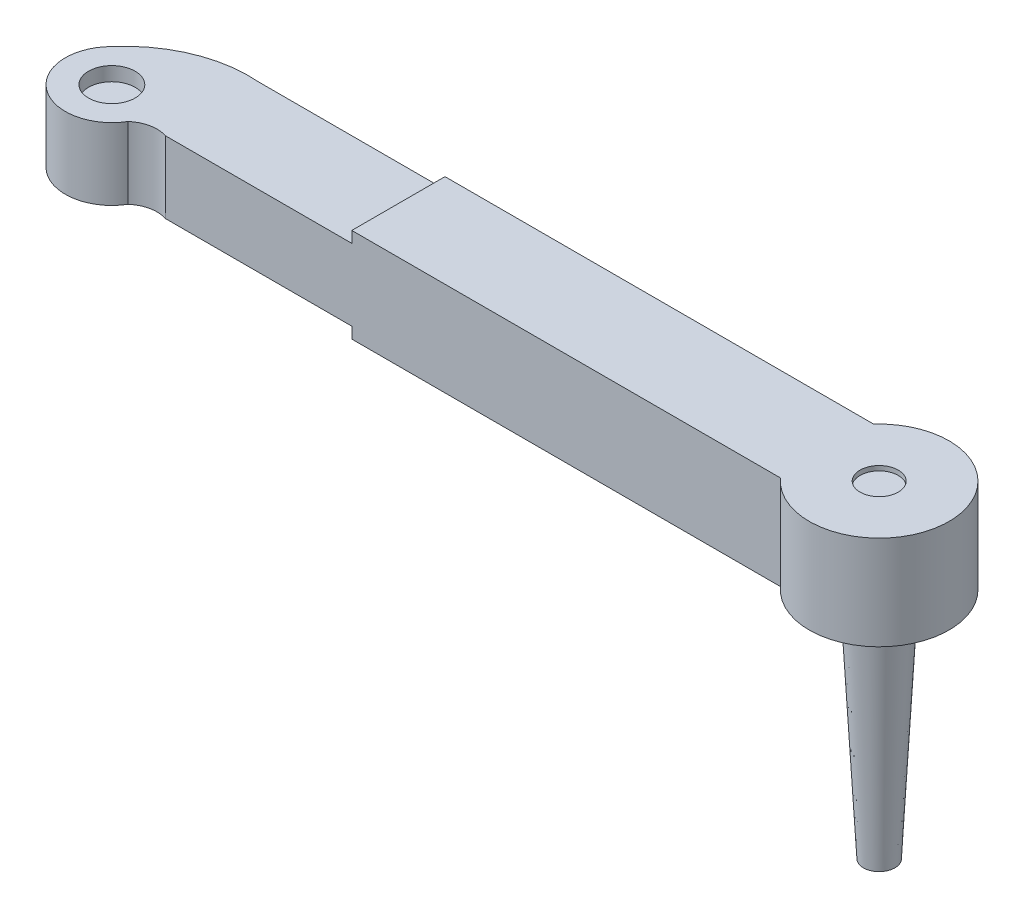
ISO-10303-21;
HEADER;
FILE_DESCRIPTION(('STEP AP214'),'2;1');
FILE_NAME('part.step','',(''),(''),'','','');
FILE_SCHEMA(('AUTOMOTIVE_DESIGN { 1 0 10303 214 1 1 1 1 }'));
ENDSEC;
DATA;
#1=APPLICATION_CONTEXT('core data for automotive mechanical design processes');
#2=APPLICATION_PROTOCOL_DEFINITION('international standard','automotive_design',2000,#1);
#3=PRODUCT_CONTEXT('',#1,'mechanical');
#4=PRODUCT('Part','Part','',(#3));
#5=PRODUCT_RELATED_PRODUCT_CATEGORY('part','',(#4));
#6=PRODUCT_DEFINITION_FORMATION('','',#4);
#7=PRODUCT_DEFINITION_CONTEXT('part definition',#1,'design');
#8=PRODUCT_DEFINITION('design','',#6,#7);
#9=PRODUCT_DEFINITION_SHAPE('','',#8);
#10=(LENGTH_UNIT() NAMED_UNIT(*) SI_UNIT(.MILLI.,.METRE.));
#11=(NAMED_UNIT(*) PLANE_ANGLE_UNIT() SI_UNIT($,.RADIAN.));
#12=(NAMED_UNIT(*) SI_UNIT($,.STERADIAN.) SOLID_ANGLE_UNIT());
#13=UNCERTAINTY_MEASURE_WITH_UNIT(LENGTH_MEASURE(1.E-05),#10,'distance_accuracy_value','');
#14=(GEOMETRIC_REPRESENTATION_CONTEXT(3) GLOBAL_UNCERTAINTY_ASSIGNED_CONTEXT((#13)) GLOBAL_UNIT_ASSIGNED_CONTEXT((#10,
#11,#12)) REPRESENTATION_CONTEXT('',''));
#15=CARTESIAN_POINT('',(0.,0.,0.));
#16=DIRECTION('',(0.,0.,1.));
#17=DIRECTION('',(1.,0.,0.));
#18=AXIS2_PLACEMENT_3D('',#15,#16,#17);
#19=CARTESIAN_POINT('',(-33.,10.1,-5.));
#20=DIRECTION('',(0.,0.,1.));
#21=DIRECTION('',(1.,0.,0.));
#22=AXIS2_PLACEMENT_3D('',#19,#20,#21);
#23=PLANE('',#22);
#24=DIRECTION('',(1.,0.,0.));
#25=VECTOR('',#24,1.);
#26=CARTESIAN_POINT('',(-33.,1.2,-5.));
#27=LINE('',#26,#25);
#28=CARTESIAN_POINT('',(-33.,1.2,-5.));
#29=VERTEX_POINT('',#28);
#30=CARTESIAN_POINT('',(-13.,1.2,-5.));
#31=VERTEX_POINT('',#30);
#32=EDGE_CURVE('E182',#29,#31,#27,.T.);
#33=ORIENTED_EDGE('',*,*,#32,.F.);
#34=DIRECTION('',(0.,-1.,0.));
#35=VECTOR('',#34,1.);
#36=CARTESIAN_POINT('',(-33.,10.1,-5.));
#37=LINE('',#36,#35);
#38=CARTESIAN_POINT('',(-33.,8.9,-5.));
#39=VERTEX_POINT('',#38);
#40=EDGE_CURVE('E148',#39,#29,#37,.T.);
#41=ORIENTED_EDGE('',*,*,#40,.F.);
#42=DIRECTION('',(1.,0.,0.));
#43=VECTOR('',#42,1.);
#44=CARTESIAN_POINT('',(-33.,8.9,-5.));
#45=LINE('',#44,#43);
#46=CARTESIAN_POINT('',(-13.,8.9,-5.));
#47=VERTEX_POINT('',#46);
#48=EDGE_CURVE('E198',#39,#47,#45,.T.);
#49=ORIENTED_EDGE('',*,*,#48,.T.);
#50=DIRECTION('',(0.,1.,0.));
#51=VECTOR('',#50,1.);
#52=CARTESIAN_POINT('',(-13.,10.1,-5.));
#53=LINE('',#52,#51);
#54=CARTESIAN_POINT('',(-13.,10.1,-5.));
#55=VERTEX_POINT('',#54);
#56=EDGE_CURVE('E194',#47,#55,#53,.T.);
#57=ORIENTED_EDGE('',*,*,#56,.T.);
#58=DIRECTION('',(-1.,0.,0.));
#59=VECTOR('',#58,1.);
#60=CARTESIAN_POINT('',(-33.,10.1,-5.));
#61=LINE('',#60,#59);
#62=CARTESIAN_POINT('',(33.,10.1,-5.));
#63=VERTEX_POINT('',#62);
#64=EDGE_CURVE('E215',#63,#55,#61,.T.);
#65=ORIENTED_EDGE('',*,*,#64,.F.);
#66=DIRECTION('',(0.,-1.,0.));
#67=VECTOR('',#66,1.);
#68=CARTESIAN_POINT('',(33.,10.1,-5.));
#69=LINE('',#68,#67);
#70=CARTESIAN_POINT('',(33.,0.,-5.));
#71=VERTEX_POINT('',#70);
#72=EDGE_CURVE('E242',#63,#71,#69,.T.);
#73=ORIENTED_EDGE('',*,*,#72,.T.);
#74=DIRECTION('',(-1.,0.,0.));
#75=VECTOR('',#74,1.);
#76=CARTESIAN_POINT('',(-33.,0.,-5.));
#77=LINE('',#76,#75);
#78=CARTESIAN_POINT('',(-13.,0.,-5.));
#79=VERTEX_POINT('',#78);
#80=EDGE_CURVE('E227',#71,#79,#77,.T.);
#81=ORIENTED_EDGE('',*,*,#80,.T.);
#82=DIRECTION('',(0.,-1.,0.));
#83=VECTOR('',#82,1.);
#84=CARTESIAN_POINT('',(-13.,10.1,-5.));
#85=LINE('',#84,#83);
#86=EDGE_CURVE('E61',#31,#79,#85,.T.);
#87=ORIENTED_EDGE('',*,*,#86,.F.);
#88=EDGE_LOOP('',(#33,#41,#49,#57,#65,#73,#81,#87));
#89=FACE_BOUND('',#88,.T.);
#90=ADVANCED_FACE('F45',(#89),#23,.F.);
#91=CARTESIAN_POINT('',(-33.,10.1,5.));
#92=DIRECTION('',(0.,0.,-1.));
#93=DIRECTION('',(-1.,0.,0.));
#94=AXIS2_PLACEMENT_3D('',#91,#92,#93);
#95=PLANE('',#94);
#96=DIRECTION('',(1.,0.,0.));
#97=VECTOR('',#96,1.);
#98=CARTESIAN_POINT('',(-33.,1.2,5.));
#99=LINE('',#98,#97);
#100=CARTESIAN_POINT('',(-33.,1.2,5.));
#101=VERTEX_POINT('',#100);
#102=CARTESIAN_POINT('',(-13.,1.2,5.));
#103=VERTEX_POINT('',#102);
#104=EDGE_CURVE('E173',#101,#103,#99,.T.);
#105=ORIENTED_EDGE('',*,*,#104,.T.);
#106=DIRECTION('',(0.,-1.,0.));
#107=VECTOR('',#106,1.);
#108=CARTESIAN_POINT('',(-13.,0.,5.));
#109=LINE('',#108,#107);
#110=CARTESIAN_POINT('',(-13.,0.,5.));
#111=VERTEX_POINT('',#110);
#112=EDGE_CURVE('E168',#103,#111,#109,.T.);
#113=ORIENTED_EDGE('',*,*,#112,.T.);
#114=DIRECTION('',(1.,0.,0.));
#115=VECTOR('',#114,1.);
#116=CARTESIAN_POINT('',(-33.,0.,5.));
#117=LINE('',#116,#115);
#118=CARTESIAN_POINT('',(33.,0.,5.));
#119=VERTEX_POINT('',#118);
#120=EDGE_CURVE('E216',#111,#119,#117,.T.);
#121=ORIENTED_EDGE('',*,*,#120,.T.);
#122=DIRECTION('',(0.,-1.,0.));
#123=VECTOR('',#122,1.);
#124=CARTESIAN_POINT('',(33.,10.1,5.));
#125=LINE('',#124,#123);
#126=CARTESIAN_POINT('',(33.,10.1,5.));
#127=VERTEX_POINT('',#126);
#128=EDGE_CURVE('E223',#127,#119,#125,.T.);
#129=ORIENTED_EDGE('',*,*,#128,.F.);
#130=DIRECTION('',(1.,0.,0.));
#131=VECTOR('',#130,1.);
#132=CARTESIAN_POINT('',(-33.,10.1,5.));
#133=LINE('',#132,#131);
#134=CARTESIAN_POINT('',(-13.,10.1,5.));
#135=VERTEX_POINT('',#134);
#136=EDGE_CURVE('E220',#135,#127,#133,.T.);
#137=ORIENTED_EDGE('',*,*,#136,.F.);
#138=DIRECTION('',(0.,1.,0.));
#139=VECTOR('',#138,1.);
#140=CARTESIAN_POINT('',(-13.,10.1,5.));
#141=LINE('',#140,#139);
#142=CARTESIAN_POINT('',(-13.,8.9,5.));
#143=VERTEX_POINT('',#142);
#144=EDGE_CURVE('E68',#143,#135,#141,.T.);
#145=ORIENTED_EDGE('',*,*,#144,.F.);
#146=DIRECTION('',(1.,0.,0.));
#147=VECTOR('',#146,1.);
#148=CARTESIAN_POINT('',(-33.,8.9,5.));
#149=LINE('',#148,#147);
#150=CARTESIAN_POINT('',(-33.,8.9,5.));
#151=VERTEX_POINT('',#150);
#152=EDGE_CURVE('E185',#151,#143,#149,.T.);
#153=ORIENTED_EDGE('',*,*,#152,.F.);
#154=DIRECTION('',(0.,-1.,0.));
#155=VECTOR('',#154,1.);
#156=CARTESIAN_POINT('',(-33.,10.1,5.));
#157=LINE('',#156,#155);
#158=EDGE_CURVE('E236',#151,#101,#157,.T.);
#159=ORIENTED_EDGE('',*,*,#158,.T.);
#160=EDGE_LOOP('',(#105,#113,#121,#129,#137,#145,#153,#159));
#161=FACE_BOUND('',#160,.T.);
#162=ADVANCED_FACE('F251',(#161),#95,.F.);
#163=CARTESIAN_POINT('',(38.5901699437495,0.,0.));
#164=DIRECTION('',(0.,-1.,0.));
#165=DIRECTION('',(0.,0.,-1.));
#166=AXIS2_PLACEMENT_3D('',#163,#164,#165);
#167=PLANE('',#166);
#168=CARTESIAN_POINT('',(38.5901699437495,0.,0.));
#169=DIRECTION('',(0.,-1.,0.));
#170=DIRECTION('',(0.,0.,-1.));
#171=AXIS2_PLACEMENT_3D('',#168,#169,#170);
#172=CIRCLE('',#171,3.);
#173=CARTESIAN_POINT('',(38.5901699437495,0.,-3.));
#174=VERTEX_POINT('',#173);
#175=EDGE_CURVE('E324',#174,#174,#172,.T.);
#176=ORIENTED_EDGE('',*,*,#175,.F.);
#177=EDGE_LOOP('',(#176));
#178=FACE_BOUND('',#177,.T.);
#179=ORIENTED_EDGE('',*,*,#120,.F.);
#180=DIRECTION('',(0.,0.,-1.));
#181=VECTOR('',#180,1.);
#182=CARTESIAN_POINT('',(-13.,0.,0.));
#183=LINE('',#182,#181);
#184=EDGE_CURVE('E11',#111,#79,#183,.T.);
#185=ORIENTED_EDGE('',*,*,#184,.T.);
#186=ORIENTED_EDGE('',*,*,#80,.F.);
#187=CARTESIAN_POINT('',(38.5901699437495,0.,0.));
#188=DIRECTION('',(0.,1.,0.));
#189=DIRECTION('',(0.,0.,-1.));
#190=AXIS2_PLACEMENT_3D('',#187,#188,#189);
#191=CIRCLE('',#190,7.50000000000001);
#192=EDGE_CURVE('E207',#119,#71,#191,.T.);
#193=ORIENTED_EDGE('',*,*,#192,.F.);
#194=EDGE_LOOP('',(#179,#185,#186,#193));
#195=FACE_BOUND('',#194,.T.);
#196=ADVANCED_FACE('F282',(#178,#195),#167,.T.);
#197=CARTESIAN_POINT('',(38.5901699437495,10.1,0.));
#198=DIRECTION('',(0.,-1.,0.));
#199=DIRECTION('',(0.,0.,-1.));
#200=AXIS2_PLACEMENT_3D('',#197,#198,#199);
#201=CYLINDRICAL_SURFACE('',#200,7.50000000000001);
#202=ORIENTED_EDGE('',*,*,#192,.T.);
#203=ORIENTED_EDGE('',*,*,#72,.F.);
#204=CARTESIAN_POINT('',(38.5901699437495,10.1,0.));
#205=DIRECTION('',(0.,1.,0.));
#206=DIRECTION('',(0.,0.,-1.));
#207=AXIS2_PLACEMENT_3D('',#204,#205,#206);
#208=CIRCLE('',#207,7.50000000000001);
#209=EDGE_CURVE('E211',#127,#63,#208,.T.);
#210=ORIENTED_EDGE('',*,*,#209,.F.);
#211=ORIENTED_EDGE('',*,*,#128,.T.);
#212=EDGE_LOOP('',(#202,#203,#210,#211));
#213=FACE_BOUND('',#212,.T.);
#214=ADVANCED_FACE('F47',(#213),#201,.T.);
#215=CARTESIAN_POINT('',(38.5901699437495,10.1,0.));
#216=DIRECTION('',(0.,-1.,0.));
#217=DIRECTION('',(0.,0.,-1.));
#218=AXIS2_PLACEMENT_3D('',#215,#216,#217);
#219=PLANE('',#218);
#220=CARTESIAN_POINT('',(38.5901699437495,10.1,0.));
#221=DIRECTION('',(0.,1.,0.));
#222=DIRECTION('',(0.,0.,1.));
#223=AXIS2_PLACEMENT_3D('',#220,#221,#222);
#224=CIRCLE('',#223,2.04999999999999);
#225=CARTESIAN_POINT('',(38.5901699437495,10.1,2.04999999999999));
#226=VERTEX_POINT('',#225);
#227=EDGE_CURVE('E202',#226,#226,#224,.T.);
#228=ORIENTED_EDGE('',*,*,#227,.F.);
#229=EDGE_LOOP('',(#228));
#230=FACE_BOUND('',#229,.T.);
#231=ORIENTED_EDGE('',*,*,#64,.T.);
#232=DIRECTION('',(0.,0.,1.));
#233=VECTOR('',#232,1.);
#234=CARTESIAN_POINT('',(-13.,10.1,0.));
#235=LINE('',#234,#233);
#236=EDGE_CURVE('E54',#55,#135,#235,.T.);
#237=ORIENTED_EDGE('',*,*,#236,.T.);
#238=ORIENTED_EDGE('',*,*,#136,.T.);
#239=ORIENTED_EDGE('',*,*,#209,.T.);
#240=EDGE_LOOP('',(#231,#237,#238,#239));
#241=FACE_BOUND('',#240,.T.);
#242=ADVANCED_FACE('F248',(#230,#241),#219,.F.);
#243=CARTESIAN_POINT('',(38.5901699437495,9.6,0.));
#244=DIRECTION('',(0.,1.,0.));
#245=DIRECTION('',(0.,0.,1.));
#246=AXIS2_PLACEMENT_3D('',#243,#244,#245);
#247=CYLINDRICAL_SURFACE('',#246,2.04999999999999);
#248=CARTESIAN_POINT('',(38.5901699437495,9.6,0.));
#249=DIRECTION('',(0.,1.,0.));
#250=DIRECTION('',(0.,0.,1.));
#251=AXIS2_PLACEMENT_3D('',#248,#249,#250);
#252=CIRCLE('',#251,2.04999999999999);
#253=CARTESIAN_POINT('',(38.5901699437495,9.6,2.04999999999999));
#254=VERTEX_POINT('',#253);
#255=EDGE_CURVE('E203',#254,#254,#252,.T.);
#256=ORIENTED_EDGE('',*,*,#255,.F.);
#257=EDGE_LOOP('',(#256));
#258=FACE_BOUND('',#257,.T.);
#259=ORIENTED_EDGE('',*,*,#227,.T.);
#260=EDGE_LOOP('',(#259));
#261=FACE_BOUND('',#260,.T.);
#262=ADVANCED_FACE('F290',(#258,#261),#247,.F.);
#263=CARTESIAN_POINT('',(38.5901699437495,9.6,0.));
#264=DIRECTION('',(0.,1.,0.));
#265=DIRECTION('',(0.,0.,1.));
#266=AXIS2_PLACEMENT_3D('',#263,#264,#265);
#267=PLANE('',#266);
#268=ORIENTED_EDGE('',*,*,#255,.T.);
#269=EDGE_LOOP('',(#268));
#270=FACE_BOUND('',#269,.T.);
#271=ADVANCED_FACE('F294',(#270),#267,.T.);
#272=CARTESIAN_POINT('',(-33.,8.9,-7.50000000000001));
#273=DIRECTION('',(0.,-1.,0.));
#274=DIRECTION('',(0.,0.,-1.));
#275=AXIS2_PLACEMENT_3D('',#272,#273,#274);
#276=PLANE('',#275);
#277=CARTESIAN_POINT('',(-40.6248395308679,8.9,3.12162005028124));
#278=DIRECTION('',(0.,1.,0.));
#279=DIRECTION('',(0.,0.,1.));
#280=AXIS2_PLACEMENT_3D('',#277,#278,#279);
#281=CIRCLE('',#280,2.5);
#282=CARTESIAN_POINT('',(-40.6248395308679,8.9,5.62162005028125));
#283=VERTEX_POINT('',#282);
#284=EDGE_CURVE('E156',#283,#283,#281,.T.);
#285=ORIENTED_EDGE('',*,*,#284,.F.);
#286=EDGE_LOOP('',(#285));
#287=FACE_BOUND('',#286,.T.);
#288=ORIENTED_EDGE('',*,*,#48,.F.);
#289=CARTESIAN_POINT('',(-34.0710710988994,8.9,8.25680228038053));
#290=DIRECTION('',(0.,1.,0.));
#291=DIRECTION('',(0.,0.,1.));
#292=AXIS2_PLACEMENT_3D('',#289,#290,#291);
#293=CIRCLE('',#292,13.3);
#294=CARTESIAN_POINT('',(-44.1483908735731,8.9,-0.422922724420649));
#295=VERTEX_POINT('',#294);
#296=EDGE_CURVE('E161',#39,#295,#293,.T.);
#297=ORIENTED_EDGE('',*,*,#296,.T.);
#298=CARTESIAN_POINT('',(-40.6248395308679,8.9,3.12162005028124));
#299=DIRECTION('',(0.,1.,0.));
#300=DIRECTION('',(0.,0.,1.));
#301=AXIS2_PLACEMENT_3D('',#298,#299,#300);
#302=CIRCLE('',#301,4.99791932171485);
#303=CARTESIAN_POINT('',(-36.3301368480292,8.9,5.6779311448838));
#304=VERTEX_POINT('',#303);
#305=EDGE_CURVE('E128',#295,#304,#302,.T.);
#306=ORIENTED_EDGE('',*,*,#305,.T.);
#307=CARTESIAN_POINT('',(-34.0710710988994,8.9,8.25680228038053));
#308=DIRECTION('',(0.,-1.,0.));
#309=DIRECTION('',(0.,0.,1.));
#310=AXIS2_PLACEMENT_3D('',#307,#308,#309);
#311=CIRCLE('',#310,3.42840405909067);
#312=EDGE_CURVE('E150',#304,#151,#311,.T.);
#313=ORIENTED_EDGE('',*,*,#312,.T.);
#314=ORIENTED_EDGE('',*,*,#152,.T.);
#315=DIRECTION('',(0.,0.,1.));
#316=VECTOR('',#315,1.);
#317=CARTESIAN_POINT('',(-13.,8.9,-7.50000000000001));
#318=LINE('',#317,#316);
#319=EDGE_CURVE('E191',#47,#143,#318,.T.);
#320=ORIENTED_EDGE('',*,*,#319,.F.);
#321=EDGE_LOOP('',(#288,#297,#306,#313,#314,#320));
#322=FACE_BOUND('',#321,.T.);
#323=ADVANCED_FACE('F261',(#287,#322),#276,.F.);
#324=CARTESIAN_POINT('',(-13.,10.1,-7.50000000000001));
#325=DIRECTION('',(1.,0.,0.));
#326=DIRECTION('',(0.,0.,-1.));
#327=AXIS2_PLACEMENT_3D('',#324,#325,#326);
#328=PLANE('',#327);
#329=ORIENTED_EDGE('',*,*,#319,.T.);
#330=ORIENTED_EDGE('',*,*,#144,.T.);
#331=ORIENTED_EDGE('',*,*,#236,.F.);
#332=ORIENTED_EDGE('',*,*,#56,.F.);
#333=EDGE_LOOP('',(#329,#330,#331,#332));
#334=FACE_BOUND('',#333,.T.);
#335=ADVANCED_FACE('F259',(#334),#328,.F.);
#336=CARTESIAN_POINT('',(-33.,1.2,-7.50000000000001));
#337=DIRECTION('',(0.,-1.,0.));
#338=DIRECTION('',(0.,0.,-1.));
#339=AXIS2_PLACEMENT_3D('',#336,#337,#338);
#340=PLANE('',#339);
#341=CARTESIAN_POINT('',(-40.6248395308679,1.2,3.12162005028124));
#342=DIRECTION('',(0.,1.,0.));
#343=DIRECTION('',(0.,0.,1.));
#344=AXIS2_PLACEMENT_3D('',#341,#342,#343);
#345=CIRCLE('',#344,2.5);
#346=CARTESIAN_POINT('',(-40.6248395308679,1.2,5.62162005028125));
#347=VERTEX_POINT('',#346);
#348=EDGE_CURVE('E313',#347,#347,#345,.T.);
#349=ORIENTED_EDGE('',*,*,#348,.T.);
#350=EDGE_LOOP('',(#349));
#351=FACE_BOUND('',#350,.T.);
#352=ORIENTED_EDGE('',*,*,#32,.T.);
#353=DIRECTION('',(0.,0.,1.));
#354=VECTOR('',#353,1.);
#355=CARTESIAN_POINT('',(-13.,1.2,-7.50000000000001));
#356=LINE('',#355,#354);
#357=EDGE_CURVE('E177',#31,#103,#356,.T.);
#358=ORIENTED_EDGE('',*,*,#357,.T.);
#359=ORIENTED_EDGE('',*,*,#104,.F.);
#360=CARTESIAN_POINT('',(-34.0710710988994,1.2,8.25680228038053));
#361=DIRECTION('',(0.,-1.,0.));
#362=DIRECTION('',(0.,0.,1.));
#363=AXIS2_PLACEMENT_3D('',#360,#361,#362);
#364=CIRCLE('',#363,3.42840405909067);
#365=CARTESIAN_POINT('',(-36.3301368480292,1.2,5.6779311448838));
#366=VERTEX_POINT('',#365);
#367=EDGE_CURVE('E135',#366,#101,#364,.T.);
#368=ORIENTED_EDGE('',*,*,#367,.F.);
#369=CARTESIAN_POINT('',(-40.6248395308679,1.2,3.12162005028124));
#370=DIRECTION('',(0.,1.,0.));
#371=DIRECTION('',(0.,0.,1.));
#372=AXIS2_PLACEMENT_3D('',#369,#370,#371);
#373=CIRCLE('',#372,4.99791932171485);
#374=CARTESIAN_POINT('',(-44.1483908735731,1.2,-0.422922724420649));
#375=VERTEX_POINT('',#374);
#376=EDGE_CURVE('E126',#375,#366,#373,.T.);
#377=ORIENTED_EDGE('',*,*,#376,.F.);
#378=CARTESIAN_POINT('',(-34.0710710988994,1.2,8.25680228038053));
#379=DIRECTION('',(0.,1.,0.));
#380=DIRECTION('',(0.,0.,1.));
#381=AXIS2_PLACEMENT_3D('',#378,#379,#380);
#382=CIRCLE('',#381,13.3);
#383=EDGE_CURVE('E141',#29,#375,#382,.T.);
#384=ORIENTED_EDGE('',*,*,#383,.F.);
#385=EDGE_LOOP('',(#352,#358,#359,#368,#377,#384));
#386=FACE_BOUND('',#385,.T.);
#387=ADVANCED_FACE('F140',(#351,#386),#340,.T.);
#388=CARTESIAN_POINT('',(-13.,0.,-7.50000000000001));
#389=DIRECTION('',(-1.,0.,0.));
#390=DIRECTION('',(0.,0.,1.));
#391=AXIS2_PLACEMENT_3D('',#388,#389,#390);
#392=PLANE('',#391);
#393=ORIENTED_EDGE('',*,*,#86,.T.);
#394=ORIENTED_EDGE('',*,*,#184,.F.);
#395=ORIENTED_EDGE('',*,*,#112,.F.);
#396=ORIENTED_EDGE('',*,*,#357,.F.);
#397=EDGE_LOOP('',(#393,#394,#395,#396));
#398=FACE_BOUND('',#397,.T.);
#399=ADVANCED_FACE('F274',(#398),#392,.T.);
#400=CARTESIAN_POINT('',(-34.0710710988994,1.2,8.25680228038053));
#401=DIRECTION('',(0.,1.,0.));
#402=DIRECTION('',(0.,0.,1.));
#403=AXIS2_PLACEMENT_3D('',#400,#401,#402);
#404=CYLINDRICAL_SURFACE('',#403,13.3);
#405=ORIENTED_EDGE('',*,*,#296,.F.);
#406=ORIENTED_EDGE('',*,*,#40,.T.);
#407=ORIENTED_EDGE('',*,*,#383,.T.);
#408=DIRECTION('',(0.,1.,0.));
#409=VECTOR('',#408,1.);
#410=CARTESIAN_POINT('',(-44.1483908735731,1.2,-0.422922724420649));
#411=LINE('',#410,#409);
#412=EDGE_CURVE('E123',#375,#295,#411,.T.);
#413=ORIENTED_EDGE('',*,*,#412,.T.);
#414=EDGE_LOOP('',(#405,#406,#407,#413));
#415=FACE_BOUND('',#414,.T.);
#416=ADVANCED_FACE('F146',(#415),#404,.T.);
#417=CARTESIAN_POINT('',(-34.0710710988994,1.2,8.25680228038053));
#418=DIRECTION('',(0.,1.,0.));
#419=DIRECTION('',(0.,0.,1.));
#420=AXIS2_PLACEMENT_3D('',#417,#418,#419);
#421=CYLINDRICAL_SURFACE('',#420,3.42840405909067);
#422=ORIENTED_EDGE('',*,*,#312,.F.);
#423=DIRECTION('',(0.,1.,0.));
#424=VECTOR('',#423,1.);
#425=CARTESIAN_POINT('',(-36.3301368480292,1.2,5.6779311448838));
#426=LINE('',#425,#424);
#427=EDGE_CURVE('E134',#366,#304,#426,.T.);
#428=ORIENTED_EDGE('',*,*,#427,.F.);
#429=ORIENTED_EDGE('',*,*,#367,.T.);
#430=ORIENTED_EDGE('',*,*,#158,.F.);
#431=EDGE_LOOP('',(#422,#428,#429,#430));
#432=FACE_BOUND('',#431,.T.);
#433=ADVANCED_FACE('F265',(#432),#421,.F.);
#434=CARTESIAN_POINT('',(-40.6248395308679,1.2,3.12162005028124));
#435=DIRECTION('',(0.,1.,0.));
#436=DIRECTION('',(0.,0.,1.));
#437=AXIS2_PLACEMENT_3D('',#434,#435,#436);
#438=CYLINDRICAL_SURFACE('',#437,4.99791932171485);
#439=ORIENTED_EDGE('',*,*,#305,.F.);
#440=ORIENTED_EDGE('',*,*,#412,.F.);
#441=ORIENTED_EDGE('',*,*,#376,.T.);
#442=ORIENTED_EDGE('',*,*,#427,.T.);
#443=EDGE_LOOP('',(#439,#440,#441,#442));
#444=FACE_BOUND('',#443,.T.);
#445=ADVANCED_FACE('F125',(#444),#438,.T.);
#446=CARTESIAN_POINT('',(-40.6248395308679,7.4,3.12162005028124));
#447=DIRECTION('',(0.,1.,0.));
#448=DIRECTION('',(0.,0.,1.));
#449=AXIS2_PLACEMENT_3D('',#446,#447,#448);
#450=CYLINDRICAL_SURFACE('',#449,2.5);
#451=CARTESIAN_POINT('',(-40.6248395308679,7.4,3.12162005028124));
#452=DIRECTION('',(0.,1.,0.));
#453=DIRECTION('',(0.,0.,1.));
#454=AXIS2_PLACEMENT_3D('',#451,#452,#453);
#455=CIRCLE('',#454,2.5);
#456=CARTESIAN_POINT('',(-40.6248395308679,7.4,5.62162005028125));
#457=VERTEX_POINT('',#456);
#458=EDGE_CURVE('E164',#457,#457,#455,.T.);
#459=ORIENTED_EDGE('',*,*,#458,.F.);
#460=EDGE_LOOP('',(#459));
#461=FACE_BOUND('',#460,.T.);
#462=ORIENTED_EDGE('',*,*,#284,.T.);
#463=EDGE_LOOP('',(#462));
#464=FACE_BOUND('',#463,.T.);
#465=ADVANCED_FACE('F272',(#461,#464),#450,.F.);
#466=CARTESIAN_POINT('',(-40.6248395308679,7.4,3.12162005028124));
#467=DIRECTION('',(0.,1.,0.));
#468=DIRECTION('',(0.,0.,1.));
#469=AXIS2_PLACEMENT_3D('',#466,#467,#468);
#470=PLANE('',#469);
#471=ORIENTED_EDGE('',*,*,#458,.T.);
#472=EDGE_LOOP('',(#471));
#473=FACE_BOUND('',#472,.T.);
#474=ADVANCED_FACE('F335',(#473),#470,.T.);
#475=CARTESIAN_POINT('',(-40.6248395308679,2.7,3.12162005028124));
#476=DIRECTION('',(0.,-1.,0.));
#477=DIRECTION('',(0.,0.,-1.));
#478=AXIS2_PLACEMENT_3D('',#475,#476,#477);
#479=CYLINDRICAL_SURFACE('',#478,2.5);
#480=CARTESIAN_POINT('',(-40.6248395308679,2.7,3.12162005028124));
#481=DIRECTION('',(0.,1.,0.));
#482=DIRECTION('',(0.,0.,1.));
#483=AXIS2_PLACEMENT_3D('',#480,#481,#482);
#484=CIRCLE('',#483,2.5);
#485=CARTESIAN_POINT('',(-40.6248395308679,2.7,5.62162005028125));
#486=VERTEX_POINT('',#485);
#487=EDGE_CURVE('E316',#486,#486,#484,.T.);
#488=ORIENTED_EDGE('',*,*,#487,.T.);
#489=EDGE_LOOP('',(#488));
#490=FACE_BOUND('',#489,.T.);
#491=ORIENTED_EDGE('',*,*,#348,.F.);
#492=EDGE_LOOP('',(#491));
#493=FACE_BOUND('',#492,.T.);
#494=ADVANCED_FACE('F339',(#490,#493),#479,.F.);
#495=CARTESIAN_POINT('',(-40.6248395308679,2.7,3.12162005028124));
#496=DIRECTION('',(0.,-1.,0.));
#497=DIRECTION('',(0.,0.,1.));
#498=AXIS2_PLACEMENT_3D('',#495,#496,#497);
#499=PLANE('',#498);
#500=ORIENTED_EDGE('',*,*,#487,.F.);
#501=EDGE_LOOP('',(#500));
#502=FACE_BOUND('',#501,.T.);
#503=ADVANCED_FACE('F343',(#502),#499,.T.);
#504=CARTESIAN_POINT('',(38.5901699437495,0.,0.));
#505=DIRECTION('',(0.,1.,0.));
#506=DIRECTION('',(0.,0.,-1.));
#507=AXIS2_PLACEMENT_3D('',#504,#505,#506);
#508=CONICAL_SURFACE('',#507,3.,0.0523598775598299);
#509=CARTESIAN_POINT('',(38.5901699437495,-25.,0.));
#510=DIRECTION('',(0.,-1.,0.));
#511=DIRECTION('',(0.,0.,-1.));
#512=AXIS2_PLACEMENT_3D('',#509,#510,#511);
#513=CIRCLE('',#512,1.68980551792397);
#514=CARTESIAN_POINT('',(38.5901699437495,-25.,-1.68980551792397));
#515=VERTEX_POINT('',#514);
#516=EDGE_CURVE('E317',#515,#515,#513,.T.);
#517=ORIENTED_EDGE('',*,*,#516,.F.);
#518=EDGE_LOOP('',(#517));
#519=FACE_BOUND('',#518,.T.);
#520=ORIENTED_EDGE('',*,*,#175,.T.);
#521=EDGE_LOOP('',(#520));
#522=FACE_BOUND('',#521,.T.);
#523=ADVANCED_FACE('F347',(#519,#522),#508,.T.);
#524=CARTESIAN_POINT('',(38.5901699437495,-25.,0.));
#525=DIRECTION('',(0.,-1.,0.));
#526=DIRECTION('',(0.,0.,-1.));
#527=AXIS2_PLACEMENT_3D('',#524,#525,#526);
#528=PLANE('',#527);
#529=ORIENTED_EDGE('',*,*,#516,.T.);
#530=EDGE_LOOP('',(#529));
#531=FACE_BOUND('',#530,.T.);
#532=ADVANCED_FACE('F351',(#531),#528,.T.);
#533=CLOSED_SHELL('',(#90,#162,#196,#214,#242,#262,#271,#323,#335,#387,#399,#416,#433,#445,#465,
#474,#494,#503,#523,#532));
#534=MANIFOLD_SOLID_BREP('B2',#533);
#535=ADVANCED_BREP_SHAPE_REPRESENTATION('',(#18,#534),#14);
#536=SHAPE_DEFINITION_REPRESENTATION(#9,#535);
ENDSEC;
END-ISO-10303-21;
